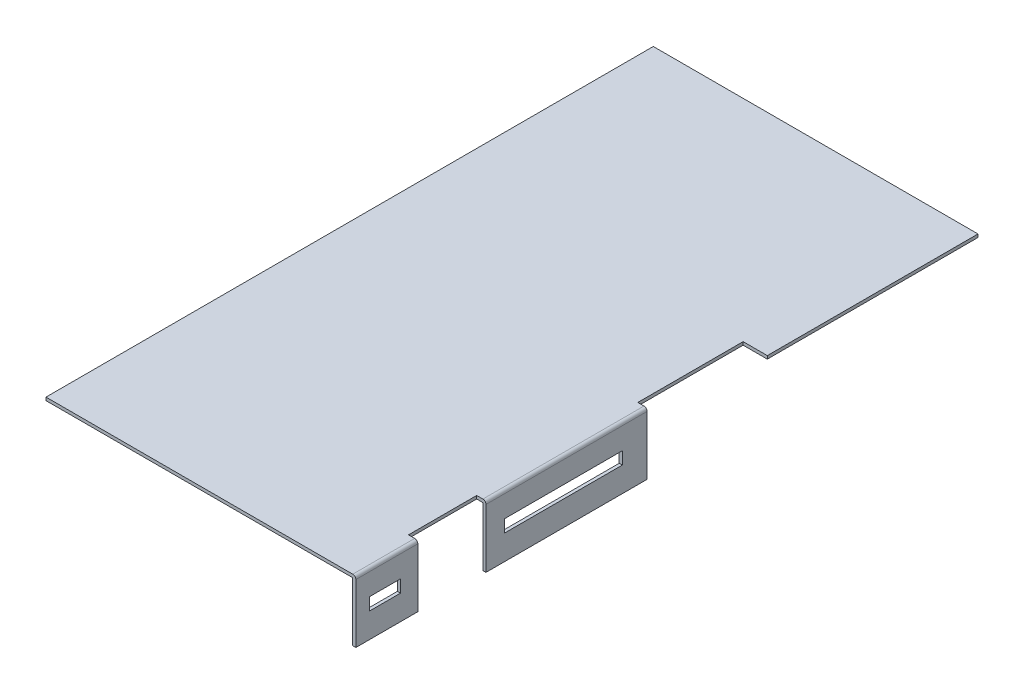
ISO-10303-21;
HEADER;
FILE_DESCRIPTION(('STEP AP214'),'2;1');
FILE_NAME('part.step','',(''),(''),'','','');
FILE_SCHEMA(('AUTOMOTIVE_DESIGN { 1 0 10303 214 1 1 1 1 }'));
ENDSEC;
DATA;
#1=APPLICATION_CONTEXT('core data for automotive mechanical design processes');
#2=APPLICATION_PROTOCOL_DEFINITION('international standard','automotive_design',2000,#1);
#3=PRODUCT_CONTEXT('',#1,'mechanical');
#4=PRODUCT('Part','Part','',(#3));
#5=PRODUCT_RELATED_PRODUCT_CATEGORY('part','',(#4));
#6=PRODUCT_DEFINITION_FORMATION('','',#4);
#7=PRODUCT_DEFINITION_CONTEXT('part definition',#1,'design');
#8=PRODUCT_DEFINITION('design','',#6,#7);
#9=PRODUCT_DEFINITION_SHAPE('','',#8);
#10=(LENGTH_UNIT() NAMED_UNIT(*) SI_UNIT(.MILLI.,.METRE.));
#11=(NAMED_UNIT(*) PLANE_ANGLE_UNIT() SI_UNIT($,.RADIAN.));
#12=(NAMED_UNIT(*) SI_UNIT($,.STERADIAN.) SOLID_ANGLE_UNIT());
#13=UNCERTAINTY_MEASURE_WITH_UNIT(LENGTH_MEASURE(1.E-05),#10,'distance_accuracy_value','');
#14=(GEOMETRIC_REPRESENTATION_CONTEXT(3) GLOBAL_UNCERTAINTY_ASSIGNED_CONTEXT((#13)) GLOBAL_UNIT_ASSIGNED_CONTEXT((#10,
#11,#12)) REPRESENTATION_CONTEXT('',''));
#15=CARTESIAN_POINT('',(0.,0.,0.));
#16=DIRECTION('',(0.,0.,1.));
#17=DIRECTION('',(1.,0.,0.));
#18=AXIS2_PLACEMENT_3D('',#15,#16,#17);
#19=CARTESIAN_POINT('',(12.5,0.,0.));
#20=DIRECTION('',(-1.,0.,0.));
#21=DIRECTION('',(0.,-1.,0.));
#22=AXIS2_PLACEMENT_3D('',#19,#20,#21);
#23=PLANE('',#22);
#24=DIRECTION('',(0.,1.,0.));
#25=VECTOR('',#24,1.);
#26=CARTESIAN_POINT('',(12.5,0.,19.5));
#27=LINE('',#26,#25);
#28=CARTESIAN_POINT('',(12.5,-5.,19.5));
#29=VERTEX_POINT('',#28);
#30=CARTESIAN_POINT('',(12.5,-0.249999999999999,19.5));
#31=VERTEX_POINT('',#30);
#32=EDGE_CURVE('E104',#29,#31,#27,.T.);
#33=ORIENTED_EDGE('',*,*,#32,.T.);
#34=DIRECTION('',(0.,0.,-1.));
#35=VECTOR('',#34,1.);
#36=CARTESIAN_POINT('',(12.5,-0.249999999999995,1.));
#37=LINE('',#36,#35);
#38=CARTESIAN_POINT('',(12.5,-0.25,24.5));
#39=VERTEX_POINT('',#38);
#40=EDGE_CURVE('E107',#39,#31,#37,.T.);
#41=ORIENTED_EDGE('',*,*,#40,.F.);
#42=DIRECTION('',(0.,1.,0.));
#43=VECTOR('',#42,1.);
#44=CARTESIAN_POINT('',(12.5,-5.,24.5));
#45=LINE('',#44,#43);
#46=CARTESIAN_POINT('',(12.5,-5.,24.5));
#47=VERTEX_POINT('',#46);
#48=EDGE_CURVE('E132',#39,#47,#45,.F.);
#49=ORIENTED_EDGE('',*,*,#48,.T.);
#50=DIRECTION('',(0.,0.,1.));
#51=VECTOR('',#50,1.);
#52=CARTESIAN_POINT('',(12.5,-5.,1.));
#53=LINE('',#52,#51);
#54=EDGE_CURVE('E110',#47,#29,#53,.F.);
#55=ORIENTED_EDGE('',*,*,#54,.T.);
#56=EDGE_LOOP('',(#33,#41,#49,#55));
#57=FACE_BOUND('',#56,.T.);
#58=DIRECTION('',(0.,1.,0.));
#59=VECTOR('',#58,1.);
#60=CARTESIAN_POINT('',(12.5,-2.,23.4));
#61=LINE('',#60,#59);
#62=CARTESIAN_POINT('',(12.5,-3.,23.4));
#63=VERTEX_POINT('',#62);
#64=CARTESIAN_POINT('',(12.5,-2.,23.4));
#65=VERTEX_POINT('',#64);
#66=EDGE_CURVE('E178',#63,#65,#61,.T.);
#67=ORIENTED_EDGE('',*,*,#66,.T.);
#68=DIRECTION('',(0.,0.,1.));
#69=VECTOR('',#68,1.);
#70=CARTESIAN_POINT('',(12.5,-2.,23.4));
#71=LINE('',#70,#69);
#72=CARTESIAN_POINT('',(12.5,-2.,20.9));
#73=VERTEX_POINT('',#72);
#74=EDGE_CURVE('E150',#65,#73,#71,.F.);
#75=ORIENTED_EDGE('',*,*,#74,.T.);
#76=DIRECTION('',(0.,1.,0.));
#77=VECTOR('',#76,1.);
#78=CARTESIAN_POINT('',(12.5,-2.,20.9));
#79=LINE('',#78,#77);
#80=CARTESIAN_POINT('',(12.5,-3.,20.9));
#81=VERTEX_POINT('',#80);
#82=EDGE_CURVE('E169',#73,#81,#79,.F.);
#83=ORIENTED_EDGE('',*,*,#82,.T.);
#84=DIRECTION('',(0.,0.,1.));
#85=VECTOR('',#84,1.);
#86=CARTESIAN_POINT('',(12.5,-3.,23.4));
#87=LINE('',#86,#85);
#88=EDGE_CURVE('E175',#81,#63,#87,.T.);
#89=ORIENTED_EDGE('',*,*,#88,.T.);
#90=EDGE_LOOP('',(#67,#75,#83,#89));
#91=FACE_BOUND('',#90,.T.);
#92=ADVANCED_FACE('F17',(#57,#91),#23,.F.);
#93=CARTESIAN_POINT('',(12.5,0.,0.));
#94=DIRECTION('',(-1.,0.,0.));
#95=DIRECTION('',(0.,-1.,0.));
#96=AXIS2_PLACEMENT_3D('',#93,#94,#95);
#97=PLANE('',#96);
#98=DIRECTION('',(0.,1.,0.));
#99=VECTOR('',#98,1.);
#100=CARTESIAN_POINT('',(12.5,0.,14.));
#101=LINE('',#100,#99);
#102=CARTESIAN_POINT('',(12.5,-0.249999999999996,14.));
#103=VERTEX_POINT('',#102);
#104=CARTESIAN_POINT('',(12.5,-5.,14.));
#105=VERTEX_POINT('',#104);
#106=EDGE_CURVE('E144',#103,#105,#101,.F.);
#107=ORIENTED_EDGE('',*,*,#106,.T.);
#108=DIRECTION('',(0.,0.,1.));
#109=VECTOR('',#108,1.);
#110=CARTESIAN_POINT('',(12.5,-5.,1.));
#111=LINE('',#110,#109);
#112=CARTESIAN_POINT('',(12.5,-5.,1.));
#113=VERTEX_POINT('',#112);
#114=EDGE_CURVE('E232',#105,#113,#111,.F.);
#115=ORIENTED_EDGE('',*,*,#114,.T.);
#116=DIRECTION('',(0.,1.,0.));
#117=VECTOR('',#116,1.);
#118=CARTESIAN_POINT('',(12.5,-0.249999999999995,1.));
#119=LINE('',#118,#117);
#120=CARTESIAN_POINT('',(12.5,-0.249999999999994,1.));
#121=VERTEX_POINT('',#120);
#122=EDGE_CURVE('E141',#113,#121,#119,.T.);
#123=ORIENTED_EDGE('',*,*,#122,.T.);
#124=DIRECTION('',(0.,0.,-1.));
#125=VECTOR('',#124,1.);
#126=CARTESIAN_POINT('',(12.5,-0.249999999999992,1.));
#127=LINE('',#126,#125);
#128=EDGE_CURVE('E124',#103,#121,#127,.T.);
#129=ORIENTED_EDGE('',*,*,#128,.F.);
#130=EDGE_LOOP('',(#107,#115,#123,#129));
#131=FACE_BOUND('',#130,.T.);
#132=DIRECTION('',(0.,1.,0.));
#133=VECTOR('',#132,1.);
#134=CARTESIAN_POINT('',(12.5,-2.,12.5));
#135=LINE('',#134,#133);
#136=CARTESIAN_POINT('',(12.5,-3.,12.5));
#137=VERTEX_POINT('',#136);
#138=CARTESIAN_POINT('',(12.5,-2.,12.5));
#139=VERTEX_POINT('',#138);
#140=EDGE_CURVE('E235',#137,#139,#135,.T.);
#141=ORIENTED_EDGE('',*,*,#140,.T.);
#142=DIRECTION('',(0.,0.,1.));
#143=VECTOR('',#142,1.);
#144=CARTESIAN_POINT('',(12.5,-2.,12.5));
#145=LINE('',#144,#143);
#146=CARTESIAN_POINT('',(12.5,-2.,3.));
#147=VERTEX_POINT('',#146);
#148=EDGE_CURVE('E342',#139,#147,#145,.F.);
#149=ORIENTED_EDGE('',*,*,#148,.T.);
#150=DIRECTION('',(0.,1.,0.));
#151=VECTOR('',#150,1.);
#152=CARTESIAN_POINT('',(12.5,-2.,3.));
#153=LINE('',#152,#151);
#154=CARTESIAN_POINT('',(12.5,-3.,3.));
#155=VERTEX_POINT('',#154);
#156=EDGE_CURVE('E351',#147,#155,#153,.F.);
#157=ORIENTED_EDGE('',*,*,#156,.T.);
#158=DIRECTION('',(0.,0.,1.));
#159=VECTOR('',#158,1.);
#160=CARTESIAN_POINT('',(12.5,-3.,12.5));
#161=LINE('',#160,#159);
#162=EDGE_CURVE('E357',#155,#137,#161,.T.);
#163=ORIENTED_EDGE('',*,*,#162,.T.);
#164=EDGE_LOOP('',(#141,#149,#157,#163));
#165=FACE_BOUND('',#164,.T.);
#166=ADVANCED_FACE('F516',(#131,#165),#97,.F.);
#167=CARTESIAN_POINT('',(12.25,-0.249999999999996,1.));
#168=DIRECTION('',(0.,0.,-1.));
#169=DIRECTION('',(0.,1.,0.));
#170=AXIS2_PLACEMENT_3D('',#167,#168,#169);
#171=CYLINDRICAL_SURFACE('',#170,0.250000000000001);
#172=CARTESIAN_POINT('',(12.25,-0.249999999999996,1.));
#173=DIRECTION('',(0.,0.,-1.));
#174=DIRECTION('',(0.,1.,0.));
#175=AXIS2_PLACEMENT_3D('',#172,#173,#174);
#176=CIRCLE('',#175,0.250000000000001);
#177=CARTESIAN_POINT('',(12.25,0.,1.));
#178=VERTEX_POINT('',#177);
#179=EDGE_CURVE('E143',#121,#178,#176,.F.);
#180=ORIENTED_EDGE('',*,*,#179,.T.);
#181=DIRECTION('',(0.,0.,-1.));
#182=VECTOR('',#181,1.);
#183=CARTESIAN_POINT('',(12.25,0.,0.));
#184=LINE('',#183,#182);
#185=CARTESIAN_POINT('',(12.25,0.,14.));
#186=VERTEX_POINT('',#185);
#187=EDGE_CURVE('E220',#178,#186,#184,.F.);
#188=ORIENTED_EDGE('',*,*,#187,.T.);
#189=CARTESIAN_POINT('',(12.25,-0.249999999999998,14.));
#190=DIRECTION('',(0.,0.,-1.));
#191=DIRECTION('',(0.,1.,0.));
#192=AXIS2_PLACEMENT_3D('',#189,#190,#191);
#193=CIRCLE('',#192,0.250000000000001);
#194=EDGE_CURVE('E138',#186,#103,#193,.T.);
#195=ORIENTED_EDGE('',*,*,#194,.T.);
#196=ORIENTED_EDGE('',*,*,#128,.T.);
#197=EDGE_LOOP('',(#180,#188,#195,#196));
#198=FACE_BOUND('',#197,.T.);
#199=ADVANCED_FACE('F533',(#198),#171,.T.);
#200=CARTESIAN_POINT('',(12.25,-0.249999999999996,1.));
#201=DIRECTION('',(0.,0.,-1.));
#202=DIRECTION('',(0.,1.,0.));
#203=AXIS2_PLACEMENT_3D('',#200,#201,#202);
#204=CYLINDRICAL_SURFACE('',#203,0.250000000000001);
#205=CARTESIAN_POINT('',(12.25,-0.25,24.5));
#206=DIRECTION('',(0.,0.,-1.));
#207=DIRECTION('',(0.,1.,0.));
#208=AXIS2_PLACEMENT_3D('',#205,#206,#207);
#209=CIRCLE('',#208,0.250000000000001);
#210=CARTESIAN_POINT('',(12.25,0.,24.5));
#211=VERTEX_POINT('',#210);
#212=EDGE_CURVE('E121',#39,#211,#209,.F.);
#213=ORIENTED_EDGE('',*,*,#212,.F.);
#214=ORIENTED_EDGE('',*,*,#40,.T.);
#215=CARTESIAN_POINT('',(12.25,-0.249999999999999,19.5));
#216=DIRECTION('',(0.,0.,-1.));
#217=DIRECTION('',(0.,1.,0.));
#218=AXIS2_PLACEMENT_3D('',#215,#216,#217);
#219=CIRCLE('',#218,0.250000000000001);
#220=CARTESIAN_POINT('',(12.25,0.,19.5));
#221=VERTEX_POINT('',#220);
#222=EDGE_CURVE('E20',#31,#221,#219,.F.);
#223=ORIENTED_EDGE('',*,*,#222,.T.);
#224=DIRECTION('',(0.,0.,-1.));
#225=VECTOR('',#224,1.);
#226=CARTESIAN_POINT('',(12.25,0.,0.));
#227=LINE('',#226,#225);
#228=EDGE_CURVE('E196',#221,#211,#227,.F.);
#229=ORIENTED_EDGE('',*,*,#228,.T.);
#230=EDGE_LOOP('',(#213,#214,#223,#229));
#231=FACE_BOUND('',#230,.T.);
#232=ADVANCED_FACE('F118',(#231),#204,.T.);
#233=CARTESIAN_POINT('',(11.75,0.,19.5));
#234=DIRECTION('',(0.,0.,1.));
#235=DIRECTION('',(1.,0.,0.));
#236=AXIS2_PLACEMENT_3D('',#233,#234,#235);
#237=PLANE('',#236);
#238=ORIENTED_EDGE('',*,*,#32,.F.);
#239=DIRECTION('',(-1.,0.,0.));
#240=VECTOR('',#239,1.);
#241=CARTESIAN_POINT('',(12.5,-5.,19.5));
#242=LINE('',#241,#240);
#243=CARTESIAN_POINT('',(12.25,-5.,19.5));
#244=VERTEX_POINT('',#243);
#245=EDGE_CURVE('E130',#29,#244,#242,.T.);
#246=ORIENTED_EDGE('',*,*,#245,.T.);
#247=DIRECTION('',(0.,-1.,0.));
#248=VECTOR('',#247,1.);
#249=CARTESIAN_POINT('',(12.25,0.,19.5));
#250=LINE('',#249,#248);
#251=CARTESIAN_POINT('',(12.25,-0.25,19.5));
#252=VERTEX_POINT('',#251);
#253=EDGE_CURVE('E189',#252,#244,#250,.T.);
#254=ORIENTED_EDGE('',*,*,#253,.F.);
#255=DIRECTION('',(1.,0.,0.));
#256=VECTOR('',#255,1.);
#257=CARTESIAN_POINT('',(11.75,-0.25,19.5));
#258=LINE('',#257,#256);
#259=CARTESIAN_POINT('',(11.75,-0.25,19.5));
#260=VERTEX_POINT('',#259);
#261=EDGE_CURVE('E114',#260,#252,#258,.T.);
#262=ORIENTED_EDGE('',*,*,#261,.F.);
#263=DIRECTION('',(0.,1.,0.));
#264=VECTOR('',#263,1.);
#265=CARTESIAN_POINT('',(11.75,0.,19.5));
#266=LINE('',#265,#264);
#267=CARTESIAN_POINT('',(11.75,0.,19.5));
#268=VERTEX_POINT('',#267);
#269=EDGE_CURVE('E123',#268,#260,#266,.F.);
#270=ORIENTED_EDGE('',*,*,#269,.F.);
#271=DIRECTION('',(1.,0.,0.));
#272=VECTOR('',#271,1.);
#273=CARTESIAN_POINT('',(0.,0.,19.5));
#274=LINE('',#273,#272);
#275=EDGE_CURVE('E128',#268,#221,#274,.T.);
#276=ORIENTED_EDGE('',*,*,#275,.T.);
#277=ORIENTED_EDGE('',*,*,#222,.F.);
#278=EDGE_LOOP('',(#238,#246,#254,#262,#270,#276,#277));
#279=FACE_BOUND('',#278,.T.);
#280=ADVANCED_FACE('F126',(#279),#237,.F.);
#281=CARTESIAN_POINT('',(12.5,-5.,1.));
#282=DIRECTION('',(0.,1.,0.));
#283=DIRECTION('',(-1.,0.,0.));
#284=AXIS2_PLACEMENT_3D('',#281,#282,#283);
#285=PLANE('',#284);
#286=ORIENTED_EDGE('',*,*,#245,.F.);
#287=ORIENTED_EDGE('',*,*,#54,.F.);
#288=DIRECTION('',(-1.,0.,0.));
#289=VECTOR('',#288,1.);
#290=CARTESIAN_POINT('',(12.5,-5.,24.5));
#291=LINE('',#290,#289);
#292=CARTESIAN_POINT('',(12.25,-5.,24.5));
#293=VERTEX_POINT('',#292);
#294=EDGE_CURVE('E181',#47,#293,#291,.T.);
#295=ORIENTED_EDGE('',*,*,#294,.T.);
#296=DIRECTION('',(0.,0.,1.));
#297=VECTOR('',#296,1.);
#298=CARTESIAN_POINT('',(12.25,-5.,0.));
#299=LINE('',#298,#297);
#300=EDGE_CURVE('E185',#244,#293,#299,.T.);
#301=ORIENTED_EDGE('',*,*,#300,.F.);
#302=EDGE_LOOP('',(#286,#287,#295,#301));
#303=FACE_BOUND('',#302,.T.);
#304=ADVANCED_FACE('F262',(#303),#285,.F.);
#305=CARTESIAN_POINT('',(11.75,-2.,23.4));
#306=DIRECTION('',(0.,0.,1.));
#307=DIRECTION('',(1.,0.,0.));
#308=AXIS2_PLACEMENT_3D('',#305,#306,#307);
#309=PLANE('',#308);
#310=DIRECTION('',(-1.,0.,0.));
#311=VECTOR('',#310,1.);
#312=CARTESIAN_POINT('',(11.75,-2.,23.4));
#313=LINE('',#312,#311);
#314=CARTESIAN_POINT('',(12.25,-2.,23.4));
#315=VERTEX_POINT('',#314);
#316=EDGE_CURVE('E158',#315,#65,#313,.F.);
#317=ORIENTED_EDGE('',*,*,#316,.T.);
#318=ORIENTED_EDGE('',*,*,#66,.F.);
#319=DIRECTION('',(1.,0.,0.));
#320=VECTOR('',#319,1.);
#321=CARTESIAN_POINT('',(11.75,-3.,23.4));
#322=LINE('',#321,#320);
#323=CARTESIAN_POINT('',(12.25,-3.,23.4));
#324=VERTEX_POINT('',#323);
#325=EDGE_CURVE('E172',#63,#324,#322,.F.);
#326=ORIENTED_EDGE('',*,*,#325,.T.);
#327=DIRECTION('',(0.,-1.,0.));
#328=VECTOR('',#327,1.);
#329=CARTESIAN_POINT('',(12.25,0.,23.4));
#330=LINE('',#329,#328);
#331=EDGE_CURVE('E273',#315,#324,#330,.T.);
#332=ORIENTED_EDGE('',*,*,#331,.F.);
#333=EDGE_LOOP('',(#317,#318,#326,#332));
#334=FACE_BOUND('',#333,.T.);
#335=ADVANCED_FACE('F607',(#334),#309,.F.);
#336=CARTESIAN_POINT('',(11.75,-3.,23.4));
#337=DIRECTION('',(0.,-1.,0.));
#338=DIRECTION('',(1.,0.,0.));
#339=AXIS2_PLACEMENT_3D('',#336,#337,#338);
#340=PLANE('',#339);
#341=ORIENTED_EDGE('',*,*,#325,.F.);
#342=ORIENTED_EDGE('',*,*,#88,.F.);
#343=DIRECTION('',(-1.,0.,0.));
#344=VECTOR('',#343,1.);
#345=CARTESIAN_POINT('',(11.75,-3.,20.9));
#346=LINE('',#345,#344);
#347=CARTESIAN_POINT('',(12.25,-3.,20.9));
#348=VERTEX_POINT('',#347);
#349=EDGE_CURVE('E166',#81,#348,#346,.T.);
#350=ORIENTED_EDGE('',*,*,#349,.T.);
#351=DIRECTION('',(0.,0.,1.));
#352=VECTOR('',#351,1.);
#353=CARTESIAN_POINT('',(12.25,-3.,0.));
#354=LINE('',#353,#352);
#355=EDGE_CURVE('E334',#324,#348,#354,.F.);
#356=ORIENTED_EDGE('',*,*,#355,.F.);
#357=EDGE_LOOP('',(#341,#342,#350,#356));
#358=FACE_BOUND('',#357,.T.);
#359=ADVANCED_FACE('F604',(#358),#340,.F.);
#360=CARTESIAN_POINT('',(11.75,-2.,20.9));
#361=DIRECTION('',(0.,0.,-1.));
#362=DIRECTION('',(-1.,0.,0.));
#363=AXIS2_PLACEMENT_3D('',#360,#361,#362);
#364=PLANE('',#363);
#365=ORIENTED_EDGE('',*,*,#349,.F.);
#366=ORIENTED_EDGE('',*,*,#82,.F.);
#367=DIRECTION('',(-1.,0.,0.));
#368=VECTOR('',#367,1.);
#369=CARTESIAN_POINT('',(11.75,-2.,20.9));
#370=LINE('',#369,#368);
#371=CARTESIAN_POINT('',(12.25,-2.,20.9));
#372=VERTEX_POINT('',#371);
#373=EDGE_CURVE('E145',#73,#372,#370,.T.);
#374=ORIENTED_EDGE('',*,*,#373,.T.);
#375=DIRECTION('',(0.,-1.,0.));
#376=VECTOR('',#375,1.);
#377=CARTESIAN_POINT('',(12.25,0.,20.9));
#378=LINE('',#377,#376);
#379=EDGE_CURVE('E331',#348,#372,#378,.F.);
#380=ORIENTED_EDGE('',*,*,#379,.F.);
#381=EDGE_LOOP('',(#365,#366,#374,#380));
#382=FACE_BOUND('',#381,.T.);
#383=ADVANCED_FACE('F600',(#382),#364,.F.);
#384=CARTESIAN_POINT('',(11.75,-2.,23.4));
#385=DIRECTION('',(0.,1.,0.));
#386=DIRECTION('',(-1.,0.,0.));
#387=AXIS2_PLACEMENT_3D('',#384,#385,#386);
#388=PLANE('',#387);
#389=ORIENTED_EDGE('',*,*,#373,.F.);
#390=ORIENTED_EDGE('',*,*,#74,.F.);
#391=ORIENTED_EDGE('',*,*,#316,.F.);
#392=DIRECTION('',(0.,0.,1.));
#393=VECTOR('',#392,1.);
#394=CARTESIAN_POINT('',(12.25,-2.,0.));
#395=LINE('',#394,#393);
#396=EDGE_CURVE('E328',#372,#315,#395,.T.);
#397=ORIENTED_EDGE('',*,*,#396,.F.);
#398=EDGE_LOOP('',(#389,#390,#391,#397));
#399=FACE_BOUND('',#398,.T.);
#400=ADVANCED_FACE('F597',(#399),#388,.F.);
#401=CARTESIAN_POINT('',(11.75,0.,14.));
#402=DIRECTION('',(0.,0.,-1.));
#403=DIRECTION('',(-1.,0.,0.));
#404=AXIS2_PLACEMENT_3D('',#401,#402,#403);
#405=PLANE('',#404);
#406=DIRECTION('',(1.,0.,0.));
#407=VECTOR('',#406,1.);
#408=CARTESIAN_POINT('',(0.,0.,14.));
#409=LINE('',#408,#407);
#410=CARTESIAN_POINT('',(11.75,0.,14.));
#411=VERTEX_POINT('',#410);
#412=EDGE_CURVE('E205',#186,#411,#409,.F.);
#413=ORIENTED_EDGE('',*,*,#412,.T.);
#414=DIRECTION('',(0.,1.,0.));
#415=VECTOR('',#414,1.);
#416=CARTESIAN_POINT('',(11.75,0.,14.));
#417=LINE('',#416,#415);
#418=CARTESIAN_POINT('',(11.75,-0.249999999999999,14.));
#419=VERTEX_POINT('',#418);
#420=EDGE_CURVE('E142',#419,#411,#417,.T.);
#421=ORIENTED_EDGE('',*,*,#420,.F.);
#422=DIRECTION('',(-1.,0.,0.));
#423=VECTOR('',#422,1.);
#424=CARTESIAN_POINT('',(11.75,-0.249999999999998,14.));
#425=LINE('',#424,#423);
#426=CARTESIAN_POINT('',(12.25,-0.249999999999999,14.));
#427=VERTEX_POINT('',#426);
#428=EDGE_CURVE('E35',#427,#419,#425,.T.);
#429=ORIENTED_EDGE('',*,*,#428,.F.);
#430=DIRECTION('',(0.,-1.,0.));
#431=VECTOR('',#430,1.);
#432=CARTESIAN_POINT('',(12.25,0.,14.));
#433=LINE('',#432,#431);
#434=CARTESIAN_POINT('',(12.25,-5.,14.));
#435=VERTEX_POINT('',#434);
#436=EDGE_CURVE('E249',#435,#427,#433,.F.);
#437=ORIENTED_EDGE('',*,*,#436,.F.);
#438=DIRECTION('',(-1.,0.,0.));
#439=VECTOR('',#438,1.);
#440=CARTESIAN_POINT('',(12.5,-5.,14.));
#441=LINE('',#440,#439);
#442=EDGE_CURVE('E236',#435,#105,#441,.F.);
#443=ORIENTED_EDGE('',*,*,#442,.T.);
#444=ORIENTED_EDGE('',*,*,#106,.F.);
#445=ORIENTED_EDGE('',*,*,#194,.F.);
#446=EDGE_LOOP('',(#413,#421,#429,#437,#443,#444,#445));
#447=FACE_BOUND('',#446,.T.);
#448=ADVANCED_FACE('F284',(#447),#405,.F.);
#449=CARTESIAN_POINT('',(12.5,-5.,1.));
#450=DIRECTION('',(0.,1.,0.));
#451=DIRECTION('',(-1.,0.,0.));
#452=AXIS2_PLACEMENT_3D('',#449,#450,#451);
#453=PLANE('',#452);
#454=ORIENTED_EDGE('',*,*,#442,.F.);
#455=DIRECTION('',(0.,0.,1.));
#456=VECTOR('',#455,1.);
#457=CARTESIAN_POINT('',(12.25,-5.,0.));
#458=LINE('',#457,#456);
#459=CARTESIAN_POINT('',(12.25,-5.,1.));
#460=VERTEX_POINT('',#459);
#461=EDGE_CURVE('E325',#460,#435,#458,.T.);
#462=ORIENTED_EDGE('',*,*,#461,.F.);
#463=DIRECTION('',(-1.,0.,0.));
#464=VECTOR('',#463,1.);
#465=CARTESIAN_POINT('',(12.5,-5.,1.));
#466=LINE('',#465,#464);
#467=EDGE_CURVE('E229',#113,#460,#466,.T.);
#468=ORIENTED_EDGE('',*,*,#467,.F.);
#469=ORIENTED_EDGE('',*,*,#114,.F.);
#470=EDGE_LOOP('',(#454,#462,#468,#469));
#471=FACE_BOUND('',#470,.T.);
#472=ADVANCED_FACE('F520',(#471),#453,.F.);
#473=CARTESIAN_POINT('',(11.75,-2.,12.5));
#474=DIRECTION('',(0.,0.,1.));
#475=DIRECTION('',(1.,0.,0.));
#476=AXIS2_PLACEMENT_3D('',#473,#474,#475);
#477=PLANE('',#476);
#478=DIRECTION('',(-1.,0.,0.));
#479=VECTOR('',#478,1.);
#480=CARTESIAN_POINT('',(11.75,-2.,12.5));
#481=LINE('',#480,#479);
#482=CARTESIAN_POINT('',(12.25,-2.,12.5));
#483=VERTEX_POINT('',#482);
#484=EDGE_CURVE('E345',#483,#139,#481,.F.);
#485=ORIENTED_EDGE('',*,*,#484,.T.);
#486=ORIENTED_EDGE('',*,*,#140,.F.);
#487=DIRECTION('',(1.,0.,0.));
#488=VECTOR('',#487,1.);
#489=CARTESIAN_POINT('',(11.75,-3.,12.5));
#490=LINE('',#489,#488);
#491=CARTESIAN_POINT('',(12.25,-3.,12.5));
#492=VERTEX_POINT('',#491);
#493=EDGE_CURVE('E354',#137,#492,#490,.F.);
#494=ORIENTED_EDGE('',*,*,#493,.T.);
#495=DIRECTION('',(0.,-1.,0.));
#496=VECTOR('',#495,1.);
#497=CARTESIAN_POINT('',(12.25,0.,12.5));
#498=LINE('',#497,#496);
#499=EDGE_CURVE('E322',#483,#492,#498,.T.);
#500=ORIENTED_EDGE('',*,*,#499,.F.);
#501=EDGE_LOOP('',(#485,#486,#494,#500));
#502=FACE_BOUND('',#501,.T.);
#503=ADVANCED_FACE('F588',(#502),#477,.F.);
#504=CARTESIAN_POINT('',(11.75,-3.,12.5));
#505=DIRECTION('',(0.,-1.,0.));
#506=DIRECTION('',(1.,0.,0.));
#507=AXIS2_PLACEMENT_3D('',#504,#505,#506);
#508=PLANE('',#507);
#509=ORIENTED_EDGE('',*,*,#493,.F.);
#510=ORIENTED_EDGE('',*,*,#162,.F.);
#511=DIRECTION('',(-1.,0.,0.));
#512=VECTOR('',#511,1.);
#513=CARTESIAN_POINT('',(11.75,-3.,3.));
#514=LINE('',#513,#512);
#515=CARTESIAN_POINT('',(12.25,-3.,3.));
#516=VERTEX_POINT('',#515);
#517=EDGE_CURVE('E348',#155,#516,#514,.T.);
#518=ORIENTED_EDGE('',*,*,#517,.T.);
#519=DIRECTION('',(0.,0.,1.));
#520=VECTOR('',#519,1.);
#521=CARTESIAN_POINT('',(12.25,-3.,0.));
#522=LINE('',#521,#520);
#523=EDGE_CURVE('E319',#492,#516,#522,.F.);
#524=ORIENTED_EDGE('',*,*,#523,.F.);
#525=EDGE_LOOP('',(#509,#510,#518,#524));
#526=FACE_BOUND('',#525,.T.);
#527=ADVANCED_FACE('F584',(#526),#508,.F.);
#528=CARTESIAN_POINT('',(11.75,-2.,3.));
#529=DIRECTION('',(0.,0.,-1.));
#530=DIRECTION('',(-1.,0.,0.));
#531=AXIS2_PLACEMENT_3D('',#528,#529,#530);
#532=PLANE('',#531);
#533=ORIENTED_EDGE('',*,*,#517,.F.);
#534=ORIENTED_EDGE('',*,*,#156,.F.);
#535=DIRECTION('',(-1.,0.,0.));
#536=VECTOR('',#535,1.);
#537=CARTESIAN_POINT('',(11.75,-2.,3.));
#538=LINE('',#537,#536);
#539=CARTESIAN_POINT('',(12.25,-2.,3.));
#540=VERTEX_POINT('',#539);
#541=EDGE_CURVE('E339',#147,#540,#538,.T.);
#542=ORIENTED_EDGE('',*,*,#541,.T.);
#543=DIRECTION('',(0.,-1.,0.));
#544=VECTOR('',#543,1.);
#545=CARTESIAN_POINT('',(12.25,0.,3.));
#546=LINE('',#545,#544);
#547=EDGE_CURVE('E316',#516,#540,#546,.F.);
#548=ORIENTED_EDGE('',*,*,#547,.F.);
#549=EDGE_LOOP('',(#533,#534,#542,#548));
#550=FACE_BOUND('',#549,.T.);
#551=ADVANCED_FACE('F580',(#550),#532,.F.);
#552=CARTESIAN_POINT('',(11.75,-2.,12.5));
#553=DIRECTION('',(0.,1.,0.));
#554=DIRECTION('',(-1.,0.,0.));
#555=AXIS2_PLACEMENT_3D('',#552,#553,#554);
#556=PLANE('',#555);
#557=ORIENTED_EDGE('',*,*,#541,.F.);
#558=ORIENTED_EDGE('',*,*,#148,.F.);
#559=ORIENTED_EDGE('',*,*,#484,.F.);
#560=DIRECTION('',(0.,0.,1.));
#561=VECTOR('',#560,1.);
#562=CARTESIAN_POINT('',(12.25,-2.,0.));
#563=LINE('',#562,#561);
#564=EDGE_CURVE('E215',#540,#483,#563,.T.);
#565=ORIENTED_EDGE('',*,*,#564,.F.);
#566=EDGE_LOOP('',(#557,#558,#559,#565));
#567=FACE_BOUND('',#566,.T.);
#568=ADVANCED_FACE('F577',(#567),#556,.F.);
#569=CARTESIAN_POINT('',(0.,0.,0.));
#570=DIRECTION('',(0.,-1.,0.));
#571=DIRECTION('',(0.,0.,-1.));
#572=AXIS2_PLACEMENT_3D('',#569,#570,#571);
#573=PLANE('',#572);
#574=ORIENTED_EDGE('',*,*,#275,.F.);
#575=DIRECTION('',(0.,0.,1.));
#576=VECTOR('',#575,1.);
#577=CARTESIAN_POINT('',(11.75,0.,0.));
#578=LINE('',#577,#576);
#579=EDGE_CURVE('E211',#411,#268,#578,.T.);
#580=ORIENTED_EDGE('',*,*,#579,.F.);
#581=ORIENTED_EDGE('',*,*,#412,.F.);
#582=ORIENTED_EDGE('',*,*,#187,.F.);
#583=DIRECTION('',(1.,0.,0.));
#584=VECTOR('',#583,1.);
#585=CARTESIAN_POINT('',(12.25,0.,1.));
#586=LINE('',#585,#584);
#587=CARTESIAN_POINT('',(11.75,0.,1.));
#588=VERTEX_POINT('',#587);
#589=EDGE_CURVE('E252',#588,#178,#586,.T.);
#590=ORIENTED_EDGE('',*,*,#589,.F.);
#591=DIRECTION('',(0.,0.,-1.));
#592=VECTOR('',#591,1.);
#593=CARTESIAN_POINT('',(11.75,0.,1.));
#594=LINE('',#593,#592);
#595=CARTESIAN_POINT('',(11.75,0.,-7.5));
#596=VERTEX_POINT('',#595);
#597=EDGE_CURVE('E386',#596,#588,#594,.F.);
#598=ORIENTED_EDGE('',*,*,#597,.F.);
#599=DIRECTION('',(1.,0.,0.));
#600=VECTOR('',#599,1.);
#601=CARTESIAN_POINT('',(11.75,0.,-7.5));
#602=LINE('',#601,#600);
#603=CARTESIAN_POINT('',(13.7,0.,-7.5));
#604=VERTEX_POINT('',#603);
#605=EDGE_CURVE('E401',#604,#596,#602,.F.);
#606=ORIENTED_EDGE('',*,*,#605,.F.);
#607=DIRECTION('',(0.,0.,-1.));
#608=VECTOR('',#607,1.);
#609=CARTESIAN_POINT('',(13.7,0.,-7.5));
#610=LINE('',#609,#608);
#611=CARTESIAN_POINT('',(13.7,0.,-24.5));
#612=VERTEX_POINT('',#611);
#613=EDGE_CURVE('E418',#612,#604,#610,.F.);
#614=ORIENTED_EDGE('',*,*,#613,.F.);
#615=DIRECTION('',(-1.,0.,0.));
#616=VECTOR('',#615,1.);
#617=CARTESIAN_POINT('',(-12.5,0.,-24.5));
#618=LINE('',#617,#616);
#619=CARTESIAN_POINT('',(-12.5,0.,-24.5));
#620=VERTEX_POINT('',#619);
#621=EDGE_CURVE('E428',#620,#612,#618,.F.);
#622=ORIENTED_EDGE('',*,*,#621,.F.);
#623=DIRECTION('',(0.,0.,1.));
#624=VECTOR('',#623,1.);
#625=CARTESIAN_POINT('',(-12.5,0.,24.5));
#626=LINE('',#625,#624);
#627=CARTESIAN_POINT('',(-12.5,0.,24.5));
#628=VERTEX_POINT('',#627);
#629=EDGE_CURVE('E438',#628,#620,#626,.F.);
#630=ORIENTED_EDGE('',*,*,#629,.F.);
#631=DIRECTION('',(1.,0.,0.));
#632=VECTOR('',#631,1.);
#633=CARTESIAN_POINT('',(-12.5,0.,24.5));
#634=LINE('',#633,#632);
#635=EDGE_CURVE('E294',#211,#628,#634,.F.);
#636=ORIENTED_EDGE('',*,*,#635,.F.);
#637=ORIENTED_EDGE('',*,*,#228,.F.);
#638=EDGE_LOOP('',(#574,#580,#581,#582,#590,#598,#606,#614,#622,#630,#636,#637));
#639=FACE_BOUND('',#638,.T.);
#640=ADVANCED_FACE('F292',(#639),#573,.F.);
#641=CARTESIAN_POINT('',(12.25,0.,0.));
#642=DIRECTION('',(-1.,0.,0.));
#643=DIRECTION('',(0.,-1.,0.));
#644=AXIS2_PLACEMENT_3D('',#641,#642,#643);
#645=PLANE('',#644);
#646=ORIENTED_EDGE('',*,*,#379,.T.);
#647=ORIENTED_EDGE('',*,*,#396,.T.);
#648=ORIENTED_EDGE('',*,*,#331,.T.);
#649=ORIENTED_EDGE('',*,*,#355,.T.);
#650=EDGE_LOOP('',(#646,#647,#648,#649));
#651=FACE_BOUND('',#650,.T.);
#652=DIRECTION('',(0.,-1.,0.));
#653=VECTOR('',#652,1.);
#654=CARTESIAN_POINT('',(12.25,0.,24.5));
#655=LINE('',#654,#653);
#656=CARTESIAN_POINT('',(12.25,-0.25,24.5));
#657=VERTEX_POINT('',#656);
#658=EDGE_CURVE('E188',#293,#657,#655,.F.);
#659=ORIENTED_EDGE('',*,*,#658,.T.);
#660=DIRECTION('',(0.,0.,-1.));
#661=VECTOR('',#660,1.);
#662=CARTESIAN_POINT('',(12.25,-0.25,0.));
#663=LINE('',#662,#661);
#664=EDGE_CURVE('E214',#252,#657,#663,.F.);
#665=ORIENTED_EDGE('',*,*,#664,.F.);
#666=ORIENTED_EDGE('',*,*,#253,.T.);
#667=ORIENTED_EDGE('',*,*,#300,.T.);
#668=EDGE_LOOP('',(#659,#665,#666,#667));
#669=FACE_BOUND('',#668,.T.);
#670=ADVANCED_FACE('F275',(#651,#669),#645,.T.);
#671=CARTESIAN_POINT('',(-12.5,-0.25,24.5));
#672=DIRECTION('',(0.,0.,1.));
#673=DIRECTION('',(1.,0.,0.));
#674=AXIS2_PLACEMENT_3D('',#671,#672,#673);
#675=PLANE('',#674);
#676=ORIENTED_EDGE('',*,*,#635,.T.);
#677=DIRECTION('',(0.,1.,0.));
#678=VECTOR('',#677,1.);
#679=CARTESIAN_POINT('',(-12.5,-0.25,24.5));
#680=LINE('',#679,#678);
#681=CARTESIAN_POINT('',(-12.5,-0.25,24.5));
#682=VERTEX_POINT('',#681);
#683=EDGE_CURVE('E431',#682,#628,#680,.T.);
#684=ORIENTED_EDGE('',*,*,#683,.F.);
#685=DIRECTION('',(1.,0.,0.));
#686=VECTOR('',#685,1.);
#687=CARTESIAN_POINT('',(0.,-0.25,24.5));
#688=LINE('',#687,#686);
#689=EDGE_CURVE('E269',#657,#682,#688,.F.);
#690=ORIENTED_EDGE('',*,*,#689,.F.);
#691=ORIENTED_EDGE('',*,*,#658,.F.);
#692=ORIENTED_EDGE('',*,*,#294,.F.);
#693=ORIENTED_EDGE('',*,*,#48,.F.);
#694=ORIENTED_EDGE('',*,*,#212,.T.);
#695=EDGE_LOOP('',(#676,#684,#690,#691,#692,#693,#694));
#696=FACE_BOUND('',#695,.T.);
#697=ADVANCED_FACE('F265',(#696),#675,.T.);
#698=CARTESIAN_POINT('',(-12.5,-0.25,24.5));
#699=DIRECTION('',(-1.,0.,0.));
#700=DIRECTION('',(0.,0.,1.));
#701=AXIS2_PLACEMENT_3D('',#698,#699,#700);
#702=PLANE('',#701);
#703=DIRECTION('',(0.,0.,-1.));
#704=VECTOR('',#703,1.);
#705=CARTESIAN_POINT('',(-12.5,-0.25,0.));
#706=LINE('',#705,#704);
#707=CARTESIAN_POINT('',(-12.5,-0.25,-24.5));
#708=VERTEX_POINT('',#707);
#709=EDGE_CURVE('E303',#682,#708,#706,.T.);
#710=ORIENTED_EDGE('',*,*,#709,.F.);
#711=ORIENTED_EDGE('',*,*,#683,.T.);
#712=ORIENTED_EDGE('',*,*,#629,.T.);
#713=DIRECTION('',(0.,1.,0.));
#714=VECTOR('',#713,1.);
#715=CARTESIAN_POINT('',(-12.5,-0.25,-24.5));
#716=LINE('',#715,#714);
#717=EDGE_CURVE('E421',#708,#620,#716,.T.);
#718=ORIENTED_EDGE('',*,*,#717,.F.);
#719=EDGE_LOOP('',(#710,#711,#712,#718));
#720=FACE_BOUND('',#719,.T.);
#721=ADVANCED_FACE('F451',(#720),#702,.T.);
#722=CARTESIAN_POINT('',(-12.5,-0.25,-24.5));
#723=DIRECTION('',(0.,0.,-1.));
#724=DIRECTION('',(-1.,0.,0.));
#725=AXIS2_PLACEMENT_3D('',#722,#723,#724);
#726=PLANE('',#725);
#727=DIRECTION('',(1.,0.,0.));
#728=VECTOR('',#727,1.);
#729=CARTESIAN_POINT('',(0.,-0.25,-24.5));
#730=LINE('',#729,#728);
#731=CARTESIAN_POINT('',(13.7,-0.25,-24.5));
#732=VERTEX_POINT('',#731);
#733=EDGE_CURVE('E306',#708,#732,#730,.T.);
#734=ORIENTED_EDGE('',*,*,#733,.F.);
#735=ORIENTED_EDGE('',*,*,#717,.T.);
#736=ORIENTED_EDGE('',*,*,#621,.T.);
#737=DIRECTION('',(0.,1.,0.));
#738=VECTOR('',#737,1.);
#739=CARTESIAN_POINT('',(13.7,-0.25,-24.5));
#740=LINE('',#739,#738);
#741=EDGE_CURVE('E415',#732,#612,#740,.T.);
#742=ORIENTED_EDGE('',*,*,#741,.F.);
#743=EDGE_LOOP('',(#734,#735,#736,#742));
#744=FACE_BOUND('',#743,.T.);
#745=ADVANCED_FACE('F563',(#744),#726,.T.);
#746=CARTESIAN_POINT('',(13.7,-0.25,-7.5));
#747=DIRECTION('',(1.,0.,0.));
#748=DIRECTION('',(0.,0.,-1.));
#749=AXIS2_PLACEMENT_3D('',#746,#747,#748);
#750=PLANE('',#749);
#751=DIRECTION('',(0.,0.,-1.));
#752=VECTOR('',#751,1.);
#753=CARTESIAN_POINT('',(13.7,-0.25,0.));
#754=LINE('',#753,#752);
#755=CARTESIAN_POINT('',(13.7,-0.25,-7.5));
#756=VERTEX_POINT('',#755);
#757=EDGE_CURVE('E311',#732,#756,#754,.F.);
#758=ORIENTED_EDGE('',*,*,#757,.F.);
#759=ORIENTED_EDGE('',*,*,#741,.T.);
#760=ORIENTED_EDGE('',*,*,#613,.T.);
#761=DIRECTION('',(0.,-1.,0.));
#762=VECTOR('',#761,1.);
#763=CARTESIAN_POINT('',(13.7,-0.249999999999995,-7.5));
#764=LINE('',#763,#762);
#765=EDGE_CURVE('E406',#756,#604,#764,.F.);
#766=ORIENTED_EDGE('',*,*,#765,.F.);
#767=EDGE_LOOP('',(#758,#759,#760,#766));
#768=FACE_BOUND('',#767,.T.);
#769=ADVANCED_FACE('F559',(#768),#750,.T.);
#770=CARTESIAN_POINT('',(11.75,-0.249999999999995,-7.5));
#771=DIRECTION('',(0.,0.,1.));
#772=DIRECTION('',(0.,-1.,0.));
#773=AXIS2_PLACEMENT_3D('',#770,#771,#772);
#774=PLANE('',#773);
#775=ORIENTED_EDGE('',*,*,#605,.T.);
#776=DIRECTION('',(0.,1.,0.));
#777=VECTOR('',#776,1.);
#778=CARTESIAN_POINT('',(11.75,-0.249999999999995,-7.5));
#779=LINE('',#778,#777);
#780=CARTESIAN_POINT('',(11.75,-0.25,-7.5));
#781=VERTEX_POINT('',#780);
#782=EDGE_CURVE('E391',#781,#596,#779,.T.);
#783=ORIENTED_EDGE('',*,*,#782,.F.);
#784=DIRECTION('',(1.,0.,0.));
#785=VECTOR('',#784,1.);
#786=CARTESIAN_POINT('',(0.,-0.25,-7.5));
#787=LINE('',#786,#785);
#788=EDGE_CURVE('E396',#756,#781,#787,.F.);
#789=ORIENTED_EDGE('',*,*,#788,.F.);
#790=ORIENTED_EDGE('',*,*,#765,.T.);
#791=EDGE_LOOP('',(#775,#783,#789,#790));
#792=FACE_BOUND('',#791,.T.);
#793=ADVANCED_FACE('F556',(#792),#774,.T.);
#794=CARTESIAN_POINT('',(11.75,-0.249999999999995,1.));
#795=DIRECTION('',(1.,0.,0.));
#796=DIRECTION('',(0.,0.,-1.));
#797=AXIS2_PLACEMENT_3D('',#794,#795,#796);
#798=PLANE('',#797);
#799=DIRECTION('',(0.,1.,0.));
#800=VECTOR('',#799,1.);
#801=CARTESIAN_POINT('',(11.75,-0.249999999999995,1.));
#802=LINE('',#801,#800);
#803=CARTESIAN_POINT('',(11.75,-0.25,1.));
#804=VERTEX_POINT('',#803);
#805=EDGE_CURVE('E367',#804,#588,#802,.T.);
#806=ORIENTED_EDGE('',*,*,#805,.F.);
#807=DIRECTION('',(0.,0.,-1.));
#808=VECTOR('',#807,1.);
#809=CARTESIAN_POINT('',(11.75,-0.25,0.));
#810=LINE('',#809,#808);
#811=EDGE_CURVE('E380',#781,#804,#810,.F.);
#812=ORIENTED_EDGE('',*,*,#811,.F.);
#813=ORIENTED_EDGE('',*,*,#782,.T.);
#814=ORIENTED_EDGE('',*,*,#597,.T.);
#815=EDGE_LOOP('',(#806,#812,#813,#814));
#816=FACE_BOUND('',#815,.T.);
#817=ADVANCED_FACE('F528',(#816),#798,.T.);
#818=CARTESIAN_POINT('',(12.25,-0.249999999999995,1.));
#819=DIRECTION('',(0.,0.,-1.));
#820=DIRECTION('',(0.,1.,0.));
#821=AXIS2_PLACEMENT_3D('',#818,#819,#820);
#822=PLANE('',#821);
#823=ORIENTED_EDGE('',*,*,#589,.T.);
#824=ORIENTED_EDGE('',*,*,#179,.F.);
#825=ORIENTED_EDGE('',*,*,#122,.F.);
#826=ORIENTED_EDGE('',*,*,#467,.T.);
#827=DIRECTION('',(0.,-1.,0.));
#828=VECTOR('',#827,1.);
#829=CARTESIAN_POINT('',(12.25,0.,1.));
#830=LINE('',#829,#828);
#831=CARTESIAN_POINT('',(12.25,-0.249999999999998,1.));
#832=VERTEX_POINT('',#831);
#833=EDGE_CURVE('E251',#832,#460,#830,.T.);
#834=ORIENTED_EDGE('',*,*,#833,.F.);
#835=DIRECTION('',(1.,0.,0.));
#836=VECTOR('',#835,1.);
#837=CARTESIAN_POINT('',(0.,-0.25,1.));
#838=LINE('',#837,#836);
#839=EDGE_CURVE('E375',#804,#832,#838,.T.);
#840=ORIENTED_EDGE('',*,*,#839,.F.);
#841=ORIENTED_EDGE('',*,*,#805,.T.);
#842=EDGE_LOOP('',(#823,#824,#825,#826,#834,#840,#841));
#843=FACE_BOUND('',#842,.T.);
#844=ADVANCED_FACE('F511',(#843),#822,.T.);
#845=CARTESIAN_POINT('',(12.25,0.,0.));
#846=DIRECTION('',(-1.,0.,0.));
#847=DIRECTION('',(0.,-1.,0.));
#848=AXIS2_PLACEMENT_3D('',#845,#846,#847);
#849=PLANE('',#848);
#850=ORIENTED_EDGE('',*,*,#547,.T.);
#851=ORIENTED_EDGE('',*,*,#564,.T.);
#852=ORIENTED_EDGE('',*,*,#499,.T.);
#853=ORIENTED_EDGE('',*,*,#523,.T.);
#854=EDGE_LOOP('',(#850,#851,#852,#853));
#855=FACE_BOUND('',#854,.T.);
#856=ORIENTED_EDGE('',*,*,#833,.T.);
#857=ORIENTED_EDGE('',*,*,#461,.T.);
#858=ORIENTED_EDGE('',*,*,#436,.T.);
#859=DIRECTION('',(0.,0.,-1.));
#860=VECTOR('',#859,1.);
#861=CARTESIAN_POINT('',(12.25,-0.25,0.));
#862=LINE('',#861,#860);
#863=EDGE_CURVE('E26',#832,#427,#862,.F.);
#864=ORIENTED_EDGE('',*,*,#863,.F.);
#865=EDGE_LOOP('',(#856,#857,#858,#864));
#866=FACE_BOUND('',#865,.T.);
#867=ADVANCED_FACE('F523',(#855,#866),#849,.T.);
#868=CARTESIAN_POINT('',(11.75,0.,0.));
#869=DIRECTION('',(1.,0.,0.));
#870=DIRECTION('',(0.,1.,0.));
#871=AXIS2_PLACEMENT_3D('',#868,#869,#870);
#872=PLANE('',#871);
#873=ORIENTED_EDGE('',*,*,#269,.T.);
#874=DIRECTION('',(0.,0.,-1.));
#875=VECTOR('',#874,1.);
#876=CARTESIAN_POINT('',(11.75,-0.25,0.));
#877=LINE('',#876,#875);
#878=EDGE_CURVE('E11',#419,#260,#877,.F.);
#879=ORIENTED_EDGE('',*,*,#878,.F.);
#880=ORIENTED_EDGE('',*,*,#420,.T.);
#881=ORIENTED_EDGE('',*,*,#579,.T.);
#882=EDGE_LOOP('',(#873,#879,#880,#881));
#883=FACE_BOUND('',#882,.T.);
#884=ADVANCED_FACE('F283',(#883),#872,.T.);
#885=CARTESIAN_POINT('',(0.,-0.25,0.));
#886=DIRECTION('',(0.,-1.,0.));
#887=DIRECTION('',(0.,0.,-1.));
#888=AXIS2_PLACEMENT_3D('',#885,#886,#887);
#889=PLANE('',#888);
#890=ORIENTED_EDGE('',*,*,#428,.T.);
#891=ORIENTED_EDGE('',*,*,#878,.T.);
#892=ORIENTED_EDGE('',*,*,#261,.T.);
#893=ORIENTED_EDGE('',*,*,#664,.T.);
#894=ORIENTED_EDGE('',*,*,#689,.T.);
#895=ORIENTED_EDGE('',*,*,#709,.T.);
#896=ORIENTED_EDGE('',*,*,#733,.T.);
#897=ORIENTED_EDGE('',*,*,#757,.T.);
#898=ORIENTED_EDGE('',*,*,#788,.T.);
#899=ORIENTED_EDGE('',*,*,#811,.T.);
#900=ORIENTED_EDGE('',*,*,#839,.T.);
#901=ORIENTED_EDGE('',*,*,#863,.T.);
#902=EDGE_LOOP('',(#890,#891,#892,#893,#894,#895,#896,#897,#898,#899,#900,#901));
#903=FACE_BOUND('',#902,.T.);
#904=ADVANCED_FACE('F279',(#903),#889,.T.);
#905=CLOSED_SHELL('',(#92,#166,#199,#232,#280,#304,#335,#359,#383,#400,#448,#472,#503,#527,#551,
#568,#640,#670,#697,#721,#745,#769,#793,#817,#844,#867,#884,#904));
#906=MANIFOLD_SOLID_BREP('B1',#905);
#907=ADVANCED_BREP_SHAPE_REPRESENTATION('',(#18,#906),#14);
#908=SHAPE_DEFINITION_REPRESENTATION(#9,#907);
ENDSEC;
END-ISO-10303-21;
